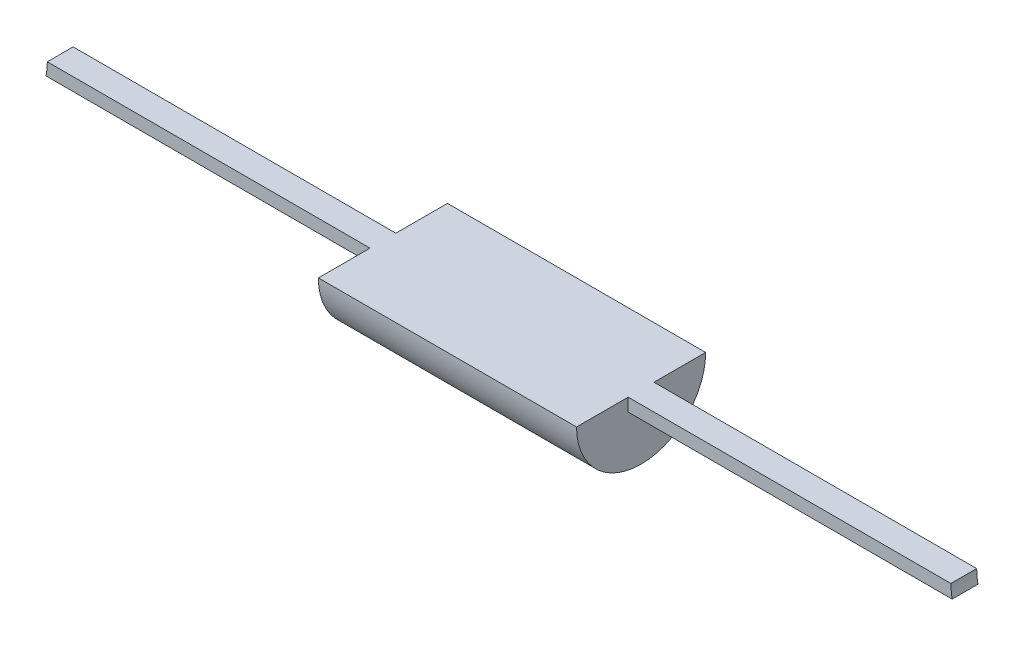
ISO-10303-21;
HEADER;
FILE_DESCRIPTION(('STEP AP214'),'2;1');
FILE_NAME('part.step','',(''),(''),'','','');
FILE_SCHEMA(('AUTOMOTIVE_DESIGN { 1 0 10303 214 1 1 1 1 }'));
ENDSEC;
DATA;
#1=APPLICATION_CONTEXT('core data for automotive mechanical design processes');
#2=APPLICATION_PROTOCOL_DEFINITION('international standard','automotive_design',2000,#1);
#3=PRODUCT_CONTEXT('',#1,'mechanical');
#4=PRODUCT('Part','Part','',(#3));
#5=PRODUCT_RELATED_PRODUCT_CATEGORY('part','',(#4));
#6=PRODUCT_DEFINITION_FORMATION('','',#4);
#7=PRODUCT_DEFINITION_CONTEXT('part definition',#1,'design');
#8=PRODUCT_DEFINITION('design','',#6,#7);
#9=PRODUCT_DEFINITION_SHAPE('','',#8);
#10=(LENGTH_UNIT() NAMED_UNIT(*) SI_UNIT(.MILLI.,.METRE.));
#11=(NAMED_UNIT(*) PLANE_ANGLE_UNIT() SI_UNIT($,.RADIAN.));
#12=(NAMED_UNIT(*) SI_UNIT($,.STERADIAN.) SOLID_ANGLE_UNIT());
#13=UNCERTAINTY_MEASURE_WITH_UNIT(LENGTH_MEASURE(1.E-05),#10,'distance_accuracy_value','');
#14=(GEOMETRIC_REPRESENTATION_CONTEXT(3) GLOBAL_UNCERTAINTY_ASSIGNED_CONTEXT((#13)) GLOBAL_UNIT_ASSIGNED_CONTEXT((#10,
#11,#12)) REPRESENTATION_CONTEXT('',''));
#15=CARTESIAN_POINT('',(0.,0.,0.));
#16=DIRECTION('',(0.,0.,1.));
#17=DIRECTION('',(1.,0.,0.));
#18=AXIS2_PLACEMENT_3D('',#15,#16,#17);
#19=CARTESIAN_POINT('',(0.,0.,0.));
#20=DIRECTION('',(0.,1.,0.));
#21=DIRECTION('',(0.,0.,1.));
#22=AXIS2_PLACEMENT_3D('',#19,#20,#21);
#23=PLANE('',#22);
#24=DIRECTION('',(-1.,0.,0.));
#25=VECTOR('',#24,1.);
#26=CARTESIAN_POINT('',(0.,0.,1.));
#27=LINE('',#26,#25);
#28=CARTESIAN_POINT('',(-10.,0.,1.));
#29=VERTEX_POINT('',#28);
#30=CARTESIAN_POINT('',(-35.,0.,1.));
#31=VERTEX_POINT('',#30);
#32=EDGE_CURVE('E178',#29,#31,#27,.T.);
#33=ORIENTED_EDGE('',*,*,#32,.F.);
#34=DIRECTION('',(0.,0.,1.));
#35=VECTOR('',#34,1.);
#36=CARTESIAN_POINT('',(-10.,0.,0.));
#37=LINE('',#36,#35);
#38=CARTESIAN_POINT('',(-10.,0.,5.));
#39=VERTEX_POINT('',#38);
#40=EDGE_CURVE('E145',#29,#39,#37,.T.);
#41=ORIENTED_EDGE('',*,*,#40,.T.);
#42=DIRECTION('',(-1.,0.,0.));
#43=VECTOR('',#42,1.);
#44=CARTESIAN_POINT('',(10.,0.,5.));
#45=LINE('',#44,#43);
#46=CARTESIAN_POINT('',(10.,0.,5.));
#47=VERTEX_POINT('',#46);
#48=EDGE_CURVE('E183',#39,#47,#45,.F.);
#49=ORIENTED_EDGE('',*,*,#48,.T.);
#50=DIRECTION('',(0.,0.,1.));
#51=VECTOR('',#50,1.);
#52=CARTESIAN_POINT('',(10.,0.,0.));
#53=LINE('',#52,#51);
#54=CARTESIAN_POINT('',(10.,0.,1.));
#55=VERTEX_POINT('',#54);
#56=EDGE_CURVE('E137',#55,#47,#53,.T.);
#57=ORIENTED_EDGE('',*,*,#56,.F.);
#58=DIRECTION('',(-1.,0.,0.));
#59=VECTOR('',#58,1.);
#60=CARTESIAN_POINT('',(0.,0.,1.));
#61=LINE('',#60,#59);
#62=CARTESIAN_POINT('',(35.,0.,1.));
#63=VERTEX_POINT('',#62);
#64=EDGE_CURVE('E152',#63,#55,#61,.T.);
#65=ORIENTED_EDGE('',*,*,#64,.F.);
#66=DIRECTION('',(0.,0.,-1.));
#67=VECTOR('',#66,1.);
#68=CARTESIAN_POINT('',(35.,0.,1.));
#69=LINE('',#68,#67);
#70=CARTESIAN_POINT('',(35.,0.,-1.));
#71=VERTEX_POINT('',#70);
#72=EDGE_CURVE('E141',#71,#63,#69,.F.);
#73=ORIENTED_EDGE('',*,*,#72,.F.);
#74=DIRECTION('',(-1.,0.,0.));
#75=VECTOR('',#74,1.);
#76=CARTESIAN_POINT('',(0.,0.,-1.));
#77=LINE('',#76,#75);
#78=CARTESIAN_POINT('',(10.,0.,-1.));
#79=VERTEX_POINT('',#78);
#80=EDGE_CURVE('E121',#71,#79,#77,.T.);
#81=ORIENTED_EDGE('',*,*,#80,.T.);
#82=CARTESIAN_POINT('',(10.,0.,-5.));
#83=VERTEX_POINT('',#82);
#84=EDGE_CURVE('E130',#83,#79,#53,.T.);
#85=ORIENTED_EDGE('',*,*,#84,.F.);
#86=DIRECTION('',(-1.,0.,0.));
#87=VECTOR('',#86,1.);
#88=CARTESIAN_POINT('',(10.,0.,-5.));
#89=LINE('',#88,#87);
#90=CARTESIAN_POINT('',(-10.,0.,-5.));
#91=VERTEX_POINT('',#90);
#92=EDGE_CURVE('E138',#83,#91,#89,.T.);
#93=ORIENTED_EDGE('',*,*,#92,.T.);
#94=CARTESIAN_POINT('',(-10.,0.,-1.));
#95=VERTEX_POINT('',#94);
#96=EDGE_CURVE('E185',#91,#95,#37,.T.);
#97=ORIENTED_EDGE('',*,*,#96,.T.);
#98=DIRECTION('',(-1.,0.,0.));
#99=VECTOR('',#98,1.);
#100=CARTESIAN_POINT('',(0.,0.,-1.));
#101=LINE('',#100,#99);
#102=CARTESIAN_POINT('',(-35.,0.,-1.));
#103=VERTEX_POINT('',#102);
#104=EDGE_CURVE('E142',#95,#103,#101,.T.);
#105=ORIENTED_EDGE('',*,*,#104,.T.);
#106=DIRECTION('',(0.,0.,-1.));
#107=VECTOR('',#106,1.);
#108=CARTESIAN_POINT('',(-35.,0.,1.));
#109=LINE('',#108,#107);
#110=EDGE_CURVE('E180',#31,#103,#109,.T.);
#111=ORIENTED_EDGE('',*,*,#110,.F.);
#112=EDGE_LOOP('',(#33,#41,#49,#57,#65,#73,#81,#85,#93,#97,#105,#111));
#113=FACE_BOUND('',#112,.T.);
#114=ADVANCED_FACE('F34',(#113),#23,.T.);
#115=CARTESIAN_POINT('',(10.,0.,0.));
#116=DIRECTION('',(-1.,0.,0.));
#117=DIRECTION('',(0.,0.,1.));
#118=AXIS2_PLACEMENT_3D('',#115,#116,#117);
#119=CYLINDRICAL_SURFACE('',#118,5.);
#120=ORIENTED_EDGE('',*,*,#92,.F.);
#121=CARTESIAN_POINT('',(10.,0.,0.));
#122=DIRECTION('',(1.,0.,0.));
#123=DIRECTION('',(0.,0.,-1.));
#124=AXIS2_PLACEMENT_3D('',#121,#122,#123);
#125=CIRCLE('',#124,5.);
#126=EDGE_CURVE('E133',#47,#83,#125,.T.);
#127=ORIENTED_EDGE('',*,*,#126,.F.);
#128=ORIENTED_EDGE('',*,*,#48,.F.);
#129=CARTESIAN_POINT('',(-10.,0.,0.));
#130=DIRECTION('',(1.,0.,0.));
#131=DIRECTION('',(0.,0.,-1.));
#132=AXIS2_PLACEMENT_3D('',#129,#130,#131);
#133=CIRCLE('',#132,5.);
#134=EDGE_CURVE('E155',#39,#91,#133,.T.);
#135=ORIENTED_EDGE('',*,*,#134,.T.);
#136=EDGE_LOOP('',(#120,#127,#128,#135));
#137=FACE_BOUND('',#136,.T.);
#138=ADVANCED_FACE('F207',(#137),#119,.T.);
#139=CARTESIAN_POINT('',(10.,0.,0.));
#140=DIRECTION('',(1.,0.,0.));
#141=DIRECTION('',(0.,0.,-1.));
#142=AXIS2_PLACEMENT_3D('',#139,#140,#141);
#143=PLANE('',#142);
#144=ORIENTED_EDGE('',*,*,#126,.T.);
#145=ORIENTED_EDGE('',*,*,#84,.T.);
#146=DIRECTION('',(0.,-1.,0.));
#147=VECTOR('',#146,1.);
#148=CARTESIAN_POINT('',(10.,0.,-1.));
#149=LINE('',#148,#147);
#150=CARTESIAN_POINT('',(10.,-1.,-1.));
#151=VERTEX_POINT('',#150);
#152=EDGE_CURVE('E117',#79,#151,#149,.T.);
#153=ORIENTED_EDGE('',*,*,#152,.T.);
#154=DIRECTION('',(0.,0.,1.));
#155=VECTOR('',#154,1.);
#156=CARTESIAN_POINT('',(10.,-1.,0.));
#157=LINE('',#156,#155);
#158=CARTESIAN_POINT('',(10.,-1.,1.));
#159=VERTEX_POINT('',#158);
#160=EDGE_CURVE('E157',#151,#159,#157,.T.);
#161=ORIENTED_EDGE('',*,*,#160,.T.);
#162=DIRECTION('',(0.,-1.,0.));
#163=VECTOR('',#162,1.);
#164=CARTESIAN_POINT('',(10.,0.,1.));
#165=LINE('',#164,#163);
#166=EDGE_CURVE('E127',#55,#159,#165,.T.);
#167=ORIENTED_EDGE('',*,*,#166,.F.);
#168=ORIENTED_EDGE('',*,*,#56,.T.);
#169=EDGE_LOOP('',(#144,#145,#153,#161,#167,#168));
#170=FACE_BOUND('',#169,.T.);
#171=ADVANCED_FACE('F131',(#170),#143,.T.);
#172=CARTESIAN_POINT('',(-10.,0.,0.));
#173=DIRECTION('',(1.,0.,0.));
#174=DIRECTION('',(0.,0.,-1.));
#175=AXIS2_PLACEMENT_3D('',#172,#173,#174);
#176=PLANE('',#175);
#177=ORIENTED_EDGE('',*,*,#96,.F.);
#178=ORIENTED_EDGE('',*,*,#134,.F.);
#179=ORIENTED_EDGE('',*,*,#40,.F.);
#180=DIRECTION('',(0.,-1.,0.));
#181=VECTOR('',#180,1.);
#182=CARTESIAN_POINT('',(-10.,0.,1.));
#183=LINE('',#182,#181);
#184=CARTESIAN_POINT('',(-10.,-1.,1.));
#185=VERTEX_POINT('',#184);
#186=EDGE_CURVE('E149',#29,#185,#183,.T.);
#187=ORIENTED_EDGE('',*,*,#186,.T.);
#188=DIRECTION('',(0.,0.,1.));
#189=VECTOR('',#188,1.);
#190=CARTESIAN_POINT('',(-10.,-1.,0.));
#191=LINE('',#190,#189);
#192=CARTESIAN_POINT('',(-10.,-1.,-1.));
#193=VERTEX_POINT('',#192);
#194=EDGE_CURVE('E151',#193,#185,#191,.T.);
#195=ORIENTED_EDGE('',*,*,#194,.F.);
#196=DIRECTION('',(0.,-1.,0.));
#197=VECTOR('',#196,1.);
#198=CARTESIAN_POINT('',(-10.,0.,-1.));
#199=LINE('',#198,#197);
#200=EDGE_CURVE('E69',#95,#193,#199,.T.);
#201=ORIENTED_EDGE('',*,*,#200,.F.);
#202=EDGE_LOOP('',(#177,#178,#179,#187,#195,#201));
#203=FACE_BOUND('',#202,.T.);
#204=ADVANCED_FACE('F215',(#203),#176,.F.);
#205=CARTESIAN_POINT('',(-40.,0.,1.));
#206=DIRECTION('',(0.,0.,-1.));
#207=DIRECTION('',(-1.,0.,0.));
#208=AXIS2_PLACEMENT_3D('',#205,#206,#207);
#209=CYLINDRICAL_SURFACE('',#208,5.);
#210=CARTESIAN_POINT('',(-40.,0.,1.));
#211=DIRECTION('',(0.,0.,1.));
#212=DIRECTION('',(1.,0.,0.));
#213=AXIS2_PLACEMENT_3D('',#210,#211,#212);
#214=CIRCLE('',#213,5.);
#215=CARTESIAN_POINT('',(-35.1010205144336,-1.,1.));
#216=VERTEX_POINT('',#215);
#217=EDGE_CURVE('E159',#216,#31,#214,.T.);
#218=ORIENTED_EDGE('',*,*,#217,.T.);
#219=ORIENTED_EDGE('',*,*,#110,.T.);
#220=CARTESIAN_POINT('',(-40.,0.,-1.));
#221=DIRECTION('',(0.,0.,1.));
#222=DIRECTION('',(1.,0.,0.));
#223=AXIS2_PLACEMENT_3D('',#220,#221,#222);
#224=CIRCLE('',#223,5.);
#225=CARTESIAN_POINT('',(-35.1010205144336,-1.,-1.));
#226=VERTEX_POINT('',#225);
#227=EDGE_CURVE('E43',#226,#103,#224,.T.);
#228=ORIENTED_EDGE('',*,*,#227,.F.);
#229=DIRECTION('',(0.,0.,-1.));
#230=VECTOR('',#229,1.);
#231=CARTESIAN_POINT('',(-35.1010205144336,-1.,1.));
#232=LINE('',#231,#230);
#233=EDGE_CURVE('E51',#216,#226,#232,.T.);
#234=ORIENTED_EDGE('',*,*,#233,.F.);
#235=EDGE_LOOP('',(#218,#219,#228,#234));
#236=FACE_BOUND('',#235,.T.);
#237=ADVANCED_FACE('F201',(#236),#209,.F.);
#238=CARTESIAN_POINT('',(0.,0.,1.));
#239=DIRECTION('',(0.,0.,1.));
#240=DIRECTION('',(1.,0.,0.));
#241=AXIS2_PLACEMENT_3D('',#238,#239,#240);
#242=PLANE('',#241);
#243=ORIENTED_EDGE('',*,*,#186,.F.);
#244=ORIENTED_EDGE('',*,*,#32,.T.);
#245=ORIENTED_EDGE('',*,*,#217,.F.);
#246=DIRECTION('',(1.,0.,0.));
#247=VECTOR('',#246,1.);
#248=CARTESIAN_POINT('',(0.,-1.,1.));
#249=LINE('',#248,#247);
#250=EDGE_CURVE('E173',#216,#185,#249,.T.);
#251=ORIENTED_EDGE('',*,*,#250,.T.);
#252=EDGE_LOOP('',(#243,#244,#245,#251));
#253=FACE_BOUND('',#252,.T.);
#254=ADVANCED_FACE('F194',(#253),#242,.T.);
#255=CARTESIAN_POINT('',(0.,0.,-1.));
#256=DIRECTION('',(0.,0.,1.));
#257=DIRECTION('',(1.,0.,0.));
#258=AXIS2_PLACEMENT_3D('',#255,#256,#257);
#259=PLANE('',#258);
#260=ORIENTED_EDGE('',*,*,#104,.F.);
#261=ORIENTED_EDGE('',*,*,#200,.T.);
#262=DIRECTION('',(1.,0.,0.));
#263=VECTOR('',#262,1.);
#264=CARTESIAN_POINT('',(0.,-1.,-1.));
#265=LINE('',#264,#263);
#266=EDGE_CURVE('E163',#226,#193,#265,.T.);
#267=ORIENTED_EDGE('',*,*,#266,.F.);
#268=ORIENTED_EDGE('',*,*,#227,.T.);
#269=EDGE_LOOP('',(#260,#261,#267,#268));
#270=FACE_BOUND('',#269,.T.);
#271=ADVANCED_FACE('F192',(#270),#259,.F.);
#272=CARTESIAN_POINT('',(40.,0.,1.));
#273=DIRECTION('',(0.,0.,-1.));
#274=DIRECTION('',(-1.,0.,0.));
#275=AXIS2_PLACEMENT_3D('',#272,#273,#274);
#276=CYLINDRICAL_SURFACE('',#275,5.);
#277=CARTESIAN_POINT('',(40.,0.,-1.));
#278=DIRECTION('',(0.,0.,1.));
#279=DIRECTION('',(1.,0.,0.));
#280=AXIS2_PLACEMENT_3D('',#277,#278,#279);
#281=CIRCLE('',#280,5.);
#282=CARTESIAN_POINT('',(35.1010205144336,-1.,-1.));
#283=VERTEX_POINT('',#282);
#284=EDGE_CURVE('E11',#71,#283,#281,.T.);
#285=ORIENTED_EDGE('',*,*,#284,.F.);
#286=ORIENTED_EDGE('',*,*,#72,.T.);
#287=CARTESIAN_POINT('',(40.,0.,1.));
#288=DIRECTION('',(0.,0.,1.));
#289=DIRECTION('',(1.,0.,0.));
#290=AXIS2_PLACEMENT_3D('',#287,#288,#289);
#291=CIRCLE('',#290,5.);
#292=CARTESIAN_POINT('',(35.1010205144336,-1.,1.));
#293=VERTEX_POINT('',#292);
#294=EDGE_CURVE('E62',#63,#293,#291,.T.);
#295=ORIENTED_EDGE('',*,*,#294,.T.);
#296=DIRECTION('',(0.,0.,-1.));
#297=VECTOR('',#296,1.);
#298=CARTESIAN_POINT('',(35.1010205144336,-1.,1.));
#299=LINE('',#298,#297);
#300=EDGE_CURVE('E171',#293,#283,#299,.T.);
#301=ORIENTED_EDGE('',*,*,#300,.T.);
#302=EDGE_LOOP('',(#285,#286,#295,#301));
#303=FACE_BOUND('',#302,.T.);
#304=ADVANCED_FACE('F36',(#303),#276,.F.);
#305=ORIENTED_EDGE('',*,*,#294,.F.);
#306=ORIENTED_EDGE('',*,*,#64,.T.);
#307=ORIENTED_EDGE('',*,*,#166,.T.);
#308=EDGE_CURVE('E162',#159,#293,#249,.T.);
#309=ORIENTED_EDGE('',*,*,#308,.T.);
#310=EDGE_LOOP('',(#305,#306,#307,#309));
#311=FACE_BOUND('',#310,.T.);
#312=ADVANCED_FACE('F200',(#311),#242,.T.);
#313=ORIENTED_EDGE('',*,*,#80,.F.);
#314=ORIENTED_EDGE('',*,*,#284,.T.);
#315=EDGE_CURVE('E123',#151,#283,#265,.T.);
#316=ORIENTED_EDGE('',*,*,#315,.F.);
#317=ORIENTED_EDGE('',*,*,#152,.F.);
#318=EDGE_LOOP('',(#313,#314,#316,#317));
#319=FACE_BOUND('',#318,.T.);
#320=ADVANCED_FACE('F119',(#319),#259,.F.);
#321=CARTESIAN_POINT('',(0.,-1.,1.));
#322=DIRECTION('',(0.,1.,0.));
#323=DIRECTION('',(0.,0.,1.));
#324=AXIS2_PLACEMENT_3D('',#321,#322,#323);
#325=PLANE('',#324);
#326=ORIENTED_EDGE('',*,*,#266,.T.);
#327=ORIENTED_EDGE('',*,*,#194,.T.);
#328=ORIENTED_EDGE('',*,*,#250,.F.);
#329=ORIENTED_EDGE('',*,*,#233,.T.);
#330=EDGE_LOOP('',(#326,#327,#328,#329));
#331=FACE_BOUND('',#330,.T.);
#332=ADVANCED_FACE('F206',(#331),#325,.F.);
#333=ORIENTED_EDGE('',*,*,#160,.F.);
#334=ORIENTED_EDGE('',*,*,#315,.T.);
#335=ORIENTED_EDGE('',*,*,#300,.F.);
#336=ORIENTED_EDGE('',*,*,#308,.F.);
#337=EDGE_LOOP('',(#333,#334,#335,#336));
#338=FACE_BOUND('',#337,.T.);
#339=ADVANCED_FACE('F217',(#338),#325,.F.);
#340=CLOSED_SHELL('',(#114,#138,#171,#204,#237,#254,#271,#304,#312,#320,#332,#339));
#341=MANIFOLD_SOLID_BREP('B2',#340);
#342=ADVANCED_BREP_SHAPE_REPRESENTATION('',(#18,#341),#14);
#343=SHAPE_DEFINITION_REPRESENTATION(#9,#342);
ENDSEC;
END-ISO-10303-21;
